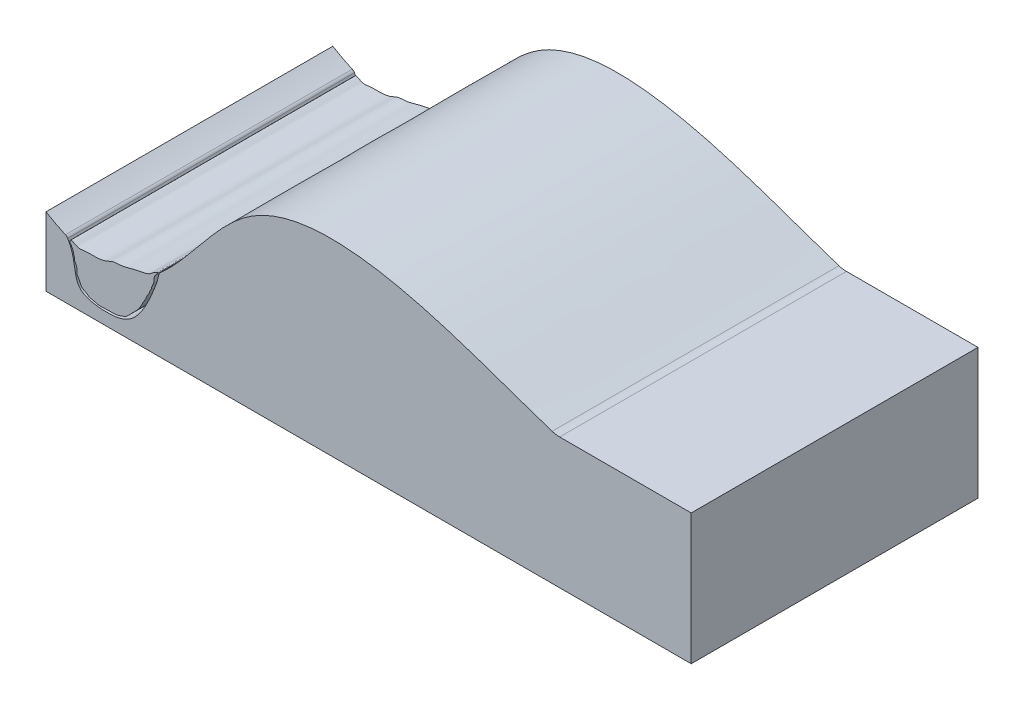
ISO-10303-21;
HEADER;
FILE_DESCRIPTION(('STEP AP214'),'2;1');
FILE_NAME('part.step','',(''),(''),'','','');
FILE_SCHEMA(('AUTOMOTIVE_DESIGN { 1 0 10303 214 1 1 1 1 }'));
ENDSEC;
DATA;
#1=APPLICATION_CONTEXT('core data for automotive mechanical design processes');
#2=APPLICATION_PROTOCOL_DEFINITION('international standard','automotive_design',2000,#1);
#3=PRODUCT_CONTEXT('',#1,'mechanical');
#4=PRODUCT('Part','Part','',(#3));
#5=PRODUCT_RELATED_PRODUCT_CATEGORY('part','',(#4));
#6=PRODUCT_DEFINITION_FORMATION('','',#4);
#7=PRODUCT_DEFINITION_CONTEXT('part definition',#1,'design');
#8=PRODUCT_DEFINITION('design','',#6,#7);
#9=PRODUCT_DEFINITION_SHAPE('','',#8);
#10=(LENGTH_UNIT() NAMED_UNIT(*) SI_UNIT(.MILLI.,.METRE.));
#11=(NAMED_UNIT(*) PLANE_ANGLE_UNIT() SI_UNIT($,.RADIAN.));
#12=(NAMED_UNIT(*) SI_UNIT($,.STERADIAN.) SOLID_ANGLE_UNIT());
#13=UNCERTAINTY_MEASURE_WITH_UNIT(LENGTH_MEASURE(1.E-05),#10,'distance_accuracy_value','');
#14=(GEOMETRIC_REPRESENTATION_CONTEXT(3) GLOBAL_UNCERTAINTY_ASSIGNED_CONTEXT((#13)) GLOBAL_UNIT_ASSIGNED_CONTEXT((#10,
#11,#12)) REPRESENTATION_CONTEXT('',''));
#15=CARTESIAN_POINT('',(0.,0.,0.));
#16=DIRECTION('',(0.,0.,1.));
#17=DIRECTION('',(1.,0.,0.));
#18=AXIS2_PLACEMENT_3D('',#15,#16,#17);
#19=CARTESIAN_POINT('',(18453.120407378,42903.9943873051,-217957.146));
#20=CARTESIAN_POINT('',(18203.1148026914,42439.5432046813,-217957.146));
#21=CARTESIAN_POINT('',(18070.7865840189,41127.0455180154,-217957.146));
#22=CARTESIAN_POINT('',(19282.2145590177,40516.7158260196,-217957.146));
#23=CARTESIAN_POINT('',(19537.7374002564,39469.7636240966,-217957.146));
#24=CARTESIAN_POINT('',(20297.8759646065,38469.1216104898,-217957.146));
#25=CARTESIAN_POINT('',(20759.1419337716,37218.3682673327,-217957.146));
#26=CARTESIAN_POINT('',(21089.9603759941,36107.5250728247,-217957.146));
#27=CARTESIAN_POINT('',(21115.2633461285,35254.8342591941,-217957.146));
#28=CARTESIAN_POINT('',(21460.4638072928,34502.1710613167,-217957.146));
#29=CARTESIAN_POINT('',(21621.4709321931,33635.4798391311,-217957.146));
#30=CARTESIAN_POINT('',(22007.1643704412,32713.1135226253,-217957.146));
#31=CARTESIAN_POINT('',(21931.7260022285,31903.5382757547,-217957.146));
#32=CARTESIAN_POINT('',(21873.2078152518,31131.155966318,-217957.146));
#33=CARTESIAN_POINT('',(22343.2117233786,30428.7305689686,-217957.146));
#34=CARTESIAN_POINT('',(22873.704039919,29744.9815546628,-217957.146));
#35=CARTESIAN_POINT('',(22878.4593514821,28895.8600068504,-217957.146));
#36=CARTESIAN_POINT('',(23660.2442996175,27985.5433933988,-217957.146));
#37=CARTESIAN_POINT('',(23527.0895336415,26476.9018335342,-217957.146));
#38=CARTESIAN_POINT('',(23757.7905491988,24769.5224805877,-217957.146));
#39=CARTESIAN_POINT('',(23527.9884886866,23006.2054731982,-217957.146));
#40=CARTESIAN_POINT('',(25051.1583024233,21270.8784655501,-217957.146));
#41=CARTESIAN_POINT('',(26082.9072055749,19021.3828018486,-217957.146));
#42=CARTESIAN_POINT('',(27304.7137493868,15781.2384394435,-217957.146));
#43=CARTESIAN_POINT('',(30638.8272396351,14774.5947712978,-217957.146));
#44=CARTESIAN_POINT('',(33326.8486721414,12299.9786082345,-217957.146));
#45=CARTESIAN_POINT('',(36520.9117968575,12108.4123723492,-217957.146));
#46=CARTESIAN_POINT('',(39786.728131325,10843.9441147948,-217957.146));
#47=CARTESIAN_POINT('',(43379.518356676,11131.8259705698,-217957.146));
#48=CARTESIAN_POINT('',(47077.0138418892,11118.5373920311,-217957.146));
#49=CARTESIAN_POINT('',(50672.1846078707,11282.3295422937,-217957.146));
#50=CARTESIAN_POINT('',(54454.2648118423,11179.5325122391,-217957.146));
#51=CARTESIAN_POINT('',(57894.7691915825,12644.0029044955,-217957.146));
#52=CARTESIAN_POINT('',(61435.8294770515,13764.8994775494,-217957.146));
#53=CARTESIAN_POINT('',(63729.2647813669,16312.8744576645,-217957.146));
#54=CARTESIAN_POINT('',(66260.075599825,18679.8959949824,-217957.146));
#55=CARTESIAN_POINT('',(68431.7918497825,21204.4500019919,-217957.146));
#56=CARTESIAN_POINT('',(70755.1438688806,23302.3136415229,-217957.146));
#57=CARTESIAN_POINT('',(72158.7838580752,25747.5678485187,-217957.146));
#58=CARTESIAN_POINT('',(73690.9638617059,28196.472307104,-217957.146));
#59=CARTESIAN_POINT('',(74618.2784756751,30683.6430975391,-217957.146));
#60=CARTESIAN_POINT('',(76552.9934465226,32965.4591929348,-217957.146));
#61=CARTESIAN_POINT('',(76995.7119309682,35793.4659308945,-217957.146));
#62=CARTESIAN_POINT('',(79031.0750282337,37598.4746489586,-217957.146));
#63=CARTESIAN_POINT('',(79194.0937732828,39860.4056586141,-217957.146));
#64=CARTESIAN_POINT('',(80640.1146720713,41164.4277622982,-217957.146));
#65=CARTESIAN_POINT('',(80694.097635989,43387.6648043391,-217957.146));
#66=CARTESIAN_POINT('',(81786.1815944237,45027.4304780346,-217957.146));
#67=CARTESIAN_POINT('',(82536.5594614461,46912.3623427988,-217957.146));
#68=CARTESIAN_POINT('',(82652.2091346204,48852.6132211194,-217957.146));
#69=CARTESIAN_POINT('',(82687.6500420254,51130.4422403183,-217957.146));
#70=CARTESIAN_POINT('',(84079.8289475113,52690.5612934202,-217957.146));
#71=CARTESIAN_POINT('',(86286.3839748042,55943.792197896,-217957.146));
#72=CARTESIAN_POINT('',(81449.8345280388,53125.8907607155,-217957.146));
#73=CARTESIAN_POINT('',(78836.8328627755,50436.5980074668,-217957.146));
#74=CARTESIAN_POINT('',(72346.051931403,49244.9439620969,-217957.146));
#75=CARTESIAN_POINT('',(65378.1528514533,47875.2527393667,-217957.146));
#76=CARTESIAN_POINT('',(58555.2407215721,45493.8790615314,-217957.146));
#77=CARTESIAN_POINT('',(51483.2006106164,45890.3030960841,-217957.146));
#78=CARTESIAN_POINT('',(45520.1415024761,42410.2060821302,-217957.146));
#79=CARTESIAN_POINT('',(37537.5175407025,41407.4955008268,-217957.146));
#80=CARTESIAN_POINT('',(30183.9146566245,41954.9182345952,-217957.146));
#81=CARTESIAN_POINT('',(23962.7542459087,40353.9665108862,-217957.146));
#82=CARTESIAN_POINT('',(19279.0411645446,44438.3594784422,-217957.146));
#83=CARTESIAN_POINT('',(18453.120407378,42903.9943873051,-217957.146));
#84=B_SPLINE_CURVE_WITH_KNOTS('',3,(#19,#20,#21,#22,#23,#24,#25,#26,#27,#28,#29,#30,#31,#32,#33,
#34,#35,#36,#37,#38,#39,#40,#41,#42,#43,#44,#45,#46,#47,#48,#49,#50,#51,#52,#53,#54,#55,#56,#57,
#58,#59,#60,#61,#62,#63,#64,#65,#66,#67,#68,#69,#70,#71,#72,#73,#74,#75,#76,#77,#78,#79,#80,#81,
#82,#83),.UNSPECIFIED.,.T.,.F.,(4,1,1,1,1,1,1,1,1,1,1,1,1,1,1,1,1,1,1,1,1,1,1,1,1,1,1,1,1,1,1,1,
1,1,1,1,1,1,1,1,1,1,1,1,1,1,1,1,1,1,1,1,1,1,1,1,1,1,1,1,1,1,4),(0.,0.0097554322366048,
0.0156681170548125,0.020243348716402,0.0266970056659213,0.0362738336504634,0.0420199304411887,
0.0457652070667872,0.0501722621278018,0.0554688831265622,0.0603188689683269,0.0663579460671775,
0.0686806680282739,0.0728356793865483,0.0796945951412897,0.0825203083639413,0.0862655849895397,
0.0984858400073749,0.105469473536518,0.115235960090819,0.126070904107022,0.14123811844707,
0.157032627782526,0.179979428023854,0.19402373519797,0.216107923493983,0.23008291367537,
0.251457004516592,0.274224419490769,0.291418838483833,0.310951811592434,0.335782133048714,
0.352434607869591,0.371184024687874,0.3908929740819,0.409956282113419,0.426055275631748,
0.442160970084193,0.456105042107834,0.473763840380501,0.485488410761632,0.504642066730716,
0.518686373904832,0.527364779335987,0.540272093235025,0.547834328054887,0.562597779794429,
0.572004086820057,0.580879194971791,0.594938859512085,0.606663429893216,0.618936548553727,
0.637852120823782,0.658106469417179,0.694415301906252,0.735783234345221,0.779274613725288,
0.811449134059962,0.849671851168482,0.889231836285604,0.943151013809343,0.967771866596964,1.),.UNSPECIFIED.);
#85=DIRECTION('',(0.,0.,1.));
#86=VECTOR('',#85,1.);
#87=SURFACE_OF_LINEAR_EXTRUSION('',#84,#86);
#88=CARTESIAN_POINT('',(18453.120407378,42903.9943873051,-217957.146));
#89=VERTEX_POINT('',#88);
#90=EDGE_CURVE('E11',#89,#89,#84,.T.);
#91=ORIENTED_EDGE('',*,*,#90,.T.);
#92=EDGE_LOOP('',(#91));
#93=FACE_BOUND('',#92,.T.);
#94=CARTESIAN_POINT('',(18453.120407378,42903.9943873051,0.));
#95=CARTESIAN_POINT('',(18203.1148026914,42439.5432046813,0.));
#96=CARTESIAN_POINT('',(18070.7865840189,41127.0455180154,0.));
#97=CARTESIAN_POINT('',(19282.2145590177,40516.7158260196,0.));
#98=CARTESIAN_POINT('',(19537.7374002564,39469.7636240966,0.));
#99=CARTESIAN_POINT('',(20297.8759646065,38469.1216104898,0.));
#100=CARTESIAN_POINT('',(20759.1419337716,37218.3682673327,0.));
#101=CARTESIAN_POINT('',(21089.9603759941,36107.5250728247,0.));
#102=CARTESIAN_POINT('',(21115.2633461285,35254.8342591941,0.));
#103=CARTESIAN_POINT('',(21460.4638072928,34502.1710613167,0.));
#104=CARTESIAN_POINT('',(21621.4709321931,33635.4798391311,0.));
#105=CARTESIAN_POINT('',(22007.1643704412,32713.1135226253,0.));
#106=CARTESIAN_POINT('',(21931.7260022285,31903.5382757547,0.));
#107=CARTESIAN_POINT('',(21873.2078152518,31131.155966318,0.));
#108=CARTESIAN_POINT('',(22343.2117233786,30428.7305689686,0.));
#109=CARTESIAN_POINT('',(22873.704039919,29744.9815546628,0.));
#110=CARTESIAN_POINT('',(22878.4593514821,28895.8600068504,0.));
#111=CARTESIAN_POINT('',(23660.2442996175,27985.5433933988,0.));
#112=CARTESIAN_POINT('',(23527.0895336415,26476.9018335342,0.));
#113=CARTESIAN_POINT('',(23757.7905491988,24769.5224805877,0.));
#114=CARTESIAN_POINT('',(23527.9884886866,23006.2054731982,0.));
#115=CARTESIAN_POINT('',(25051.1583024233,21270.8784655501,0.));
#116=CARTESIAN_POINT('',(26082.9072055749,19021.3828018486,0.));
#117=CARTESIAN_POINT('',(27304.7137493868,15781.2384394435,0.));
#118=CARTESIAN_POINT('',(30638.8272396351,14774.5947712978,0.));
#119=CARTESIAN_POINT('',(33326.8486721414,12299.9786082345,0.));
#120=CARTESIAN_POINT('',(36520.9117968575,12108.4123723492,0.));
#121=CARTESIAN_POINT('',(39786.728131325,10843.9441147948,0.));
#122=CARTESIAN_POINT('',(43379.518356676,11131.8259705698,0.));
#123=CARTESIAN_POINT('',(47077.0138418892,11118.5373920311,0.));
#124=CARTESIAN_POINT('',(50672.1846078707,11282.3295422937,0.));
#125=CARTESIAN_POINT('',(54454.2648118423,11179.5325122391,0.));
#126=CARTESIAN_POINT('',(57894.7691915825,12644.0029044955,0.));
#127=CARTESIAN_POINT('',(61435.8294770515,13764.8994775494,0.));
#128=CARTESIAN_POINT('',(63729.2647813669,16312.8744576645,0.));
#129=CARTESIAN_POINT('',(66260.075599825,18679.8959949824,0.));
#130=CARTESIAN_POINT('',(68431.7918497825,21204.4500019919,0.));
#131=CARTESIAN_POINT('',(70755.1438688806,23302.3136415229,0.));
#132=CARTESIAN_POINT('',(72158.7838580752,25747.5678485187,0.));
#133=CARTESIAN_POINT('',(73690.9638617059,28196.472307104,0.));
#134=CARTESIAN_POINT('',(74618.2784756751,30683.6430975391,0.));
#135=CARTESIAN_POINT('',(76552.9934465226,32965.4591929348,0.));
#136=CARTESIAN_POINT('',(76995.7119309682,35793.4659308945,0.));
#137=CARTESIAN_POINT('',(79031.0750282337,37598.4746489586,0.));
#138=CARTESIAN_POINT('',(79194.0937732828,39860.4056586141,0.));
#139=CARTESIAN_POINT('',(80640.1146720713,41164.4277622982,0.));
#140=CARTESIAN_POINT('',(80694.097635989,43387.6648043391,0.));
#141=CARTESIAN_POINT('',(81786.1815944237,45027.4304780346,0.));
#142=CARTESIAN_POINT('',(82536.5594614461,46912.3623427988,0.));
#143=CARTESIAN_POINT('',(82652.2091346204,48852.6132211194,0.));
#144=CARTESIAN_POINT('',(82687.6500420254,51130.4422403183,0.));
#145=CARTESIAN_POINT('',(84079.8289475113,52690.5612934202,0.));
#146=CARTESIAN_POINT('',(86286.3839748042,55943.792197896,0.));
#147=CARTESIAN_POINT('',(81449.8345280388,53125.8907607155,0.));
#148=CARTESIAN_POINT('',(78836.8328627755,50436.5980074668,0.));
#149=CARTESIAN_POINT('',(72346.051931403,49244.9439620969,0.));
#150=CARTESIAN_POINT('',(65378.1528514533,47875.2527393667,0.));
#151=CARTESIAN_POINT('',(58555.2407215721,45493.8790615314,0.));
#152=CARTESIAN_POINT('',(51483.2006106164,45890.3030960841,0.));
#153=CARTESIAN_POINT('',(45520.1415024761,42410.2060821302,0.));
#154=CARTESIAN_POINT('',(37537.5175407025,41407.4955008268,0.));
#155=CARTESIAN_POINT('',(30183.9146566245,41954.9182345952,0.));
#156=CARTESIAN_POINT('',(23962.7542459087,40353.9665108862,0.));
#157=CARTESIAN_POINT('',(19279.0411645446,44438.3594784422,0.));
#158=CARTESIAN_POINT('',(18453.120407378,42903.9943873051,0.));
#159=B_SPLINE_CURVE_WITH_KNOTS('',3,(#94,#95,#96,#97,#98,#99,#100,#101,#102,#103,#104,#105,#106,
#107,#108,#109,#110,#111,#112,#113,#114,#115,#116,#117,#118,#119,#120,#121,#122,#123,#124,#125,
#126,#127,#128,#129,#130,#131,#132,#133,#134,#135,#136,#137,#138,#139,#140,#141,#142,#143,#144,
#145,#146,#147,#148,#149,#150,#151,#152,#153,#154,#155,#156,#157,#158),.UNSPECIFIED.,.T.,.F.,(4,
1,1,1,1,1,1,1,1,1,1,1,1,1,1,1,1,1,1,1,1,1,1,1,1,1,1,1,1,1,1,1,1,1,1,1,1,1,1,1,1,1,1,1,1,1,1,1,1,
1,1,1,1,1,1,1,1,1,1,1,1,1,4),(0.,0.0097554322366048,0.0156681170548125,0.020243348716402,
0.0266970056659213,0.0362738336504634,0.0420199304411887,0.0457652070667872,0.0501722621278018,
0.0554688831265622,0.0603188689683269,0.0663579460671775,0.0686806680282739,0.0728356793865483,
0.0796945951412897,0.0825203083639413,0.0862655849895397,0.0984858400073749,0.105469473536518,
0.115235960090819,0.126070904107022,0.14123811844707,0.157032627782526,0.179979428023854,
0.19402373519797,0.216107923493983,0.23008291367537,0.251457004516592,0.274224419490769,
0.291418838483833,0.310951811592434,0.335782133048714,0.352434607869591,0.371184024687874,
0.3908929740819,0.409956282113419,0.426055275631748,0.442160970084193,0.456105042107834,
0.473763840380501,0.485488410761632,0.504642066730716,0.518686373904832,0.527364779335987,
0.540272093235025,0.547834328054887,0.562597779794429,0.572004086820057,0.580879194971791,
0.594938859512085,0.606663429893216,0.618936548553727,0.637852120823782,0.658106469417179,
0.694415301906252,0.735783234345221,0.779274613725288,0.811449134059962,0.849671851168482,
0.889231836285604,0.943151013809343,0.967771866596964,1.),.UNSPECIFIED.);
#160=CARTESIAN_POINT('',(18453.120407378,42903.9943873051,0.));
#161=VERTEX_POINT('',#160);
#162=EDGE_CURVE('E49',#161,#161,#159,.T.);
#163=ORIENTED_EDGE('',*,*,#162,.F.);
#164=EDGE_LOOP('',(#163));
#165=FACE_BOUND('',#164,.T.);
#166=ADVANCED_FACE('F45',(#93,#165),#87,.T.);
#167=CARTESIAN_POINT('',(77089.9721542229,35145.7179828665,-217957.146));
#168=DIRECTION('',(0.,0.,1.));
#169=DIRECTION('',(1.,0.,0.));
#170=AXIS2_PLACEMENT_3D('',#167,#168,#169);
#171=PLANE('',#170);
#172=ORIENTED_EDGE('',*,*,#90,.F.);
#173=EDGE_LOOP('',(#172));
#174=FACE_BOUND('',#173,.T.);
#175=ADVANCED_FACE('F68',(#174),#171,.F.);
#176=CARTESIAN_POINT('',(77089.9721542229,35145.7179828665,0.));
#177=DIRECTION('',(0.,0.,1.));
#178=DIRECTION('',(1.,0.,0.));
#179=AXIS2_PLACEMENT_3D('',#176,#177,#178);
#180=PLANE('',#179);
#181=ORIENTED_EDGE('',*,*,#162,.T.);
#182=EDGE_LOOP('',(#181));
#183=FACE_BOUND('',#182,.T.);
#184=ADVANCED_FACE('F65',(#183),#180,.T.);
#185=CLOSED_SHELL('',(#166,#175,#184));
#186=MANIFOLD_SOLID_BREP('B2',#185);
#187=CARTESIAN_POINT('',(0.,52667.8814282755,-271472.66));
#188=CARTESIAN_POINT('',(83559.6572341252,2393.55245964513,-271472.66));
#189=CARTESIAN_POINT('',(133616.286871643,210787.472707253,-271472.66));
#190=CARTESIAN_POINT('',(330012.548128856,118598.212832559,-271472.66));
#191=CARTESIAN_POINT('',(390144.,99964.3641700831,-271472.66));
#192=B_SPLINE_CURVE_WITH_KNOTS('',3,(#187,#188,#189,#190,#191),.UNSPECIFIED.,.F.,.F.,(4,1,4),
(0.,0.441082236898195,1.),.UNSPECIFIED.);
#193=DIRECTION('',(0.,0.,1.));
#194=VECTOR('',#193,1.);
#195=SURFACE_OF_LINEAR_EXTRUSION('',#192,#194);
#196=CARTESIAN_POINT('',(0.,52667.8814282755,0.));
#197=CARTESIAN_POINT('',(83559.6572341252,2393.55245964513,0.));
#198=CARTESIAN_POINT('',(133616.286871643,210787.472707253,0.));
#199=CARTESIAN_POINT('',(330012.548128856,118598.212832559,0.));
#200=CARTESIAN_POINT('',(390144.,99964.3641700831,0.));
#201=B_SPLINE_CURVE_WITH_KNOTS('',3,(#196,#197,#198,#199,#200),.UNSPECIFIED.,.F.,.F.,(4,1,4),
(0.,0.441082236898195,1.),.UNSPECIFIED.);
#202=CARTESIAN_POINT('',(0.,52667.8814282755,0.));
#203=VERTEX_POINT('',#202);
#204=CARTESIAN_POINT('',(14878.7542820508,44898.1992062694,0.));
#205=VERTEX_POINT('',#204);
#206=EDGE_CURVE('E240',#203,#205,#201,.T.);
#207=ORIENTED_EDGE('',*,*,#206,.T.);
#208=DIRECTION('',(0.,0.,1.));
#209=VECTOR('',#208,1.);
#210=CARTESIAN_POINT('',(14878.7542820508,44898.1992062694,0.));
#211=LINE('',#210,#209);
#212=CARTESIAN_POINT('',(14878.7542820508,44898.1992062694,-219456.));
#213=VERTEX_POINT('',#212);
#214=EDGE_CURVE('E283',#205,#213,#211,.F.);
#215=ORIENTED_EDGE('',*,*,#214,.T.);
#216=CARTESIAN_POINT('',(0.,52667.8814282755,-219456.));
#217=CARTESIAN_POINT('',(83559.6572341252,2393.55245964513,-219456.));
#218=CARTESIAN_POINT('',(133616.286871643,210787.472707253,-219456.));
#219=CARTESIAN_POINT('',(330012.548128856,118598.212832559,-219456.));
#220=CARTESIAN_POINT('',(390144.,99964.3641700831,-219456.));
#221=B_SPLINE_CURVE_WITH_KNOTS('',3,(#216,#217,#218,#219,#220),.UNSPECIFIED.,.F.,.F.,(4,1,4),
(0.,0.441082236898195,1.),.UNSPECIFIED.);
#222=CARTESIAN_POINT('',(0.,52667.8814282755,-219456.));
#223=VERTEX_POINT('',#222);
#224=EDGE_CURVE('E260',#223,#213,#221,.T.);
#225=ORIENTED_EDGE('',*,*,#224,.F.);
#226=DIRECTION('',(0.,0.,1.));
#227=VECTOR('',#226,1.);
#228=CARTESIAN_POINT('',(0.,52667.8814282755,-271472.66));
#229=LINE('',#228,#227);
#230=EDGE_CURVE('E248',#223,#203,#229,.T.);
#231=ORIENTED_EDGE('',*,*,#230,.T.);
#232=EDGE_LOOP('',(#207,#215,#225,#231));
#233=FACE_BOUND('',#232,.T.);
#234=ADVANCED_FACE('F97',(#233),#195,.F.);
#235=CARTESIAN_POINT('',(0.,163624.768,0.));
#236=DIRECTION('',(1.,0.,0.));
#237=DIRECTION('',(0.,0.,-1.));
#238=AXIS2_PLACEMENT_3D('',#235,#236,#237);
#239=PLANE('',#238);
#240=DIRECTION('',(0.,-1.,0.));
#241=VECTOR('',#240,1.);
#242=CARTESIAN_POINT('',(0.,163624.768,0.));
#243=LINE('',#242,#241);
#244=CARTESIAN_POINT('',(0.,0.,0.));
#245=VERTEX_POINT('',#244);
#246=EDGE_CURVE('E180',#203,#245,#243,.T.);
#247=ORIENTED_EDGE('',*,*,#246,.F.);
#248=ORIENTED_EDGE('',*,*,#230,.F.);
#249=DIRECTION('',(0.,-1.,0.));
#250=VECTOR('',#249,1.);
#251=CARTESIAN_POINT('',(0.,163624.768,-219456.));
#252=LINE('',#251,#250);
#253=CARTESIAN_POINT('',(0.,0.,-219456.));
#254=VERTEX_POINT('',#253);
#255=EDGE_CURVE('E256',#223,#254,#252,.T.);
#256=ORIENTED_EDGE('',*,*,#255,.T.);
#257=DIRECTION('',(0.,0.,1.));
#258=VECTOR('',#257,1.);
#259=CARTESIAN_POINT('',(0.,0.,0.));
#260=LINE('',#259,#258);
#261=EDGE_CURVE('E185',#254,#245,#260,.T.);
#262=ORIENTED_EDGE('',*,*,#261,.T.);
#263=EDGE_LOOP('',(#247,#248,#256,#262));
#264=FACE_BOUND('',#263,.T.);
#265=ADVANCED_FACE('F313',(#264),#239,.F.);
#266=CARTESIAN_POINT('',(0.,163624.768,0.));
#267=DIRECTION('',(0.,0.,-1.));
#268=DIRECTION('',(-1.,0.,0.));
#269=AXIS2_PLACEMENT_3D('',#266,#267,#268);
#270=PLANE('',#269);
#271=CARTESIAN_POINT('',(87478.0178261134,56099.4209561433,0.));
#272=VERTEX_POINT('',#271);
#273=CARTESIAN_POINT('',(387287.021402485,100862.173359698,0.));
#274=VERTEX_POINT('',#273);
#275=EDGE_CURVE('E249',#272,#274,#201,.T.);
#276=ORIENTED_EDGE('',*,*,#275,.F.);
#277=CARTESIAN_POINT('',(89991.0645788728,53235.7352159746,0.));
#278=DIRECTION('',(0.,0.,-1.));
#279=DIRECTION('',(-1.,0.,0.));
#280=AXIS2_PLACEMENT_3D('',#277,#278,#279);
#281=CIRCLE('',#280,3810.);
#282=CARTESIAN_POINT('',(86239.2651486449,53899.1363279285,0.));
#283=VERTEX_POINT('',#282);
#284=EDGE_CURVE('E273',#272,#283,#281,.F.);
#285=ORIENTED_EDGE('',*,*,#284,.T.);
#286=CARTESIAN_POINT('',(15943.9389295738,44438.8014705258,0.));
#287=CARTESIAN_POINT('',(24000.9795622401,32165.0707473389,0.));
#288=CARTESIAN_POINT('',(17610.9447752439,11877.3009277303,0.));
#289=CARTESIAN_POINT('',(53463.0961453246,7585.18350306893,0.));
#290=CARTESIAN_POINT('',(74840.7565307184,15824.6682265008,0.));
#291=CARTESIAN_POINT('',(91313.903548003,64441.1489142759,0.));
#292=CARTESIAN_POINT('',(81506.8274084907,54111.2602985171,0.));
#293=CARTESIAN_POINT('',(76367.1066389326,50845.0289867643,0.));
#294=CARTESIAN_POINT('',(68202.5032877185,44982.0439797142,0.));
#295=CARTESIAN_POINT('',(56865.2681827291,41044.1305606629,0.));
#296=CARTESIAN_POINT('',(45351.2438702843,39680.8730855134,0.));
#297=CARTESIAN_POINT('',(35439.5273063804,39718.4685825858,0.));
#298=CARTESIAN_POINT('',(25773.1917894854,42444.451962246,0.));
#299=CARTESIAN_POINT('',(20914.1159025462,42940.0359625946,0.));
#300=CARTESIAN_POINT('',(14431.7495730972,46625.0992974388,0.));
#301=CARTESIAN_POINT('',(15512.4481788711,45096.1149340074,0.));
#302=CARTESIAN_POINT('',(15943.9389295738,44438.8014705258,0.));
#303=B_SPLINE_CURVE_WITH_KNOTS('',3,(#286,#287,#288,#289,#290,#291,#292,#293,#294,#295,#296,
#297,#298,#299,#300,#301,#302),.UNSPECIFIED.,.T.,.F.,(4,1,1,1,1,1,1,1,1,1,1,1,1,1,4),(0.,
0.165559326181111,0.2822292468609,0.438503589805214,0.608520178236622,0.616398336145814,
0.649041552384504,0.704919284220716,0.77132780570167,0.833559197293323,0.884172895910204,
0.92720111650038,0.979409139789541,0.991133553720695,1.),.UNSPECIFIED.);
#304=CARTESIAN_POINT('',(16612.6504092085,43377.0370458632,0.));
#305=VERTEX_POINT('',#304);
#306=EDGE_CURVE('E208',#305,#283,#303,.T.);
#307=ORIENTED_EDGE('',*,*,#306,.F.);
#308=CARTESIAN_POINT('',(13350.9365433793,41407.9452101538,0.));
#309=DIRECTION('',(0.,0.,-1.));
#310=DIRECTION('',(-1.,0.,0.));
#311=AXIS2_PLACEMENT_3D('',#308,#309,#310);
#312=CIRCLE('',#311,3810.);
#313=EDGE_CURVE('E271',#305,#205,#312,.F.);
#314=ORIENTED_EDGE('',*,*,#313,.T.);
#315=ORIENTED_EDGE('',*,*,#206,.F.);
#316=ORIENTED_EDGE('',*,*,#246,.T.);
#317=DIRECTION('',(1.,0.,0.));
#318=VECTOR('',#317,1.);
#319=CARTESIAN_POINT('',(0.,0.,0.));
#320=LINE('',#319,#318);
#321=CARTESIAN_POINT('',(493723.676,0.,0.));
#322=VERTEX_POINT('',#321);
#323=EDGE_CURVE('E173',#245,#322,#320,.T.);
#324=ORIENTED_EDGE('',*,*,#323,.T.);
#325=DIRECTION('',(0.,-1.,0.));
#326=VECTOR('',#325,1.);
#327=CARTESIAN_POINT('',(493723.676,0.,0.));
#328=LINE('',#327,#326);
#329=CARTESIAN_POINT('',(493723.676,99964.3641700831,0.));
#330=VERTEX_POINT('',#329);
#331=EDGE_CURVE('E177',#330,#322,#328,.T.);
#332=ORIENTED_EDGE('',*,*,#331,.F.);
#333=DIRECTION('',(-1.,0.,0.));
#334=VECTOR('',#333,1.);
#335=CARTESIAN_POINT('',(493723.676,99964.3641700831,0.));
#336=LINE('',#335,#334);
#337=CARTESIAN_POINT('',(393066.335270357,99964.3641700831,0.));
#338=VERTEX_POINT('',#337);
#339=EDGE_CURVE('E203',#330,#338,#336,.T.);
#340=ORIENTED_EDGE('',*,*,#339,.T.);
#341=CARTESIAN_POINT('',(393066.335270357,119014.364170083,0.));
#342=DIRECTION('',(0.,0.,-1.));
#343=DIRECTION('',(-1.,0.,0.));
#344=AXIS2_PLACEMENT_3D('',#341,#342,#343);
#345=CIRCLE('',#344,19050.);
#346=EDGE_CURVE('E105',#338,#274,#345,.T.);
#347=ORIENTED_EDGE('',*,*,#346,.T.);
#348=EDGE_LOOP('',(#276,#285,#307,#314,#315,#316,#324,#332,#340,#347));
#349=FACE_BOUND('',#348,.T.);
#350=ADVANCED_FACE('F175',(#349),#270,.F.);
#351=CARTESIAN_POINT('',(0.,163624.768,-219456.));
#352=DIRECTION('',(0.,0.,1.));
#353=DIRECTION('',(1.,0.,0.));
#354=AXIS2_PLACEMENT_3D('',#351,#352,#353);
#355=PLANE('',#354);
#356=CARTESIAN_POINT('',(15943.9389295738,44438.8014705258,-219456.));
#357=CARTESIAN_POINT('',(24000.9795622401,32165.0707473389,-219456.));
#358=CARTESIAN_POINT('',(17610.9447752439,11877.3009277303,-219456.));
#359=CARTESIAN_POINT('',(53463.0961453246,7585.18350306893,-219456.));
#360=CARTESIAN_POINT('',(74840.7565307184,15824.6682265008,-219456.));
#361=CARTESIAN_POINT('',(91313.903548003,64441.1489142759,-219456.));
#362=CARTESIAN_POINT('',(81506.8274084907,54111.2602985171,-219456.));
#363=CARTESIAN_POINT('',(76367.1066389326,50845.0289867643,-219456.));
#364=CARTESIAN_POINT('',(68202.5032877185,44982.0439797142,-219456.));
#365=CARTESIAN_POINT('',(56865.2681827291,41044.1305606629,-219456.));
#366=CARTESIAN_POINT('',(45351.2438702843,39680.8730855134,-219456.));
#367=CARTESIAN_POINT('',(35439.5273063804,39718.4685825858,-219456.));
#368=CARTESIAN_POINT('',(25773.1917894854,42444.451962246,-219456.));
#369=CARTESIAN_POINT('',(20914.1159025462,42940.0359625946,-219456.));
#370=CARTESIAN_POINT('',(14431.7495730972,46625.0992974388,-219456.));
#371=CARTESIAN_POINT('',(15512.4481788711,45096.1149340074,-219456.));
#372=CARTESIAN_POINT('',(15943.9389295738,44438.8014705258,-219456.));
#373=B_SPLINE_CURVE_WITH_KNOTS('',3,(#356,#357,#358,#359,#360,#361,#362,#363,#364,#365,#366,
#367,#368,#369,#370,#371,#372),.UNSPECIFIED.,.T.,.F.,(4,1,1,1,1,1,1,1,1,1,1,1,1,1,4),(0.,
0.165559326181111,0.2822292468609,0.438503589805214,0.608520178236622,0.616398336145814,
0.649041552384504,0.704919284220716,0.77132780570167,0.833559197293323,0.884172895910204,
0.92720111650038,0.979409139789541,0.991133553720695,1.),.UNSPECIFIED.);
#374=CARTESIAN_POINT('',(16612.6504092085,43377.0370458632,-219456.));
#375=VERTEX_POINT('',#374);
#376=CARTESIAN_POINT('',(86239.2651486449,53899.1363279285,-219456.));
#377=VERTEX_POINT('',#376);
#378=EDGE_CURVE('E237',#375,#377,#373,.T.);
#379=ORIENTED_EDGE('',*,*,#378,.T.);
#380=CARTESIAN_POINT('',(89991.0645788728,53235.7352159746,-219456.));
#381=DIRECTION('',(0.,0.,1.));
#382=DIRECTION('',(1.,0.,0.));
#383=AXIS2_PLACEMENT_3D('',#380,#381,#382);
#384=CIRCLE('',#383,3810.);
#385=CARTESIAN_POINT('',(87478.0178261134,56099.4209561433,-219456.));
#386=VERTEX_POINT('',#385);
#387=EDGE_CURVE('E281',#377,#386,#384,.F.);
#388=ORIENTED_EDGE('',*,*,#387,.T.);
#389=CARTESIAN_POINT('',(387287.021402485,100862.173359698,-219456.));
#390=VERTEX_POINT('',#389);
#391=EDGE_CURVE('E259',#386,#390,#221,.T.);
#392=ORIENTED_EDGE('',*,*,#391,.T.);
#393=CARTESIAN_POINT('',(393066.335270357,119014.364170083,-219456.));
#394=DIRECTION('',(0.,0.,1.));
#395=DIRECTION('',(1.,0.,0.));
#396=AXIS2_PLACEMENT_3D('',#393,#394,#395);
#397=CIRCLE('',#396,19050.);
#398=CARTESIAN_POINT('',(393066.335270357,99964.3641700831,-219456.));
#399=VERTEX_POINT('',#398);
#400=EDGE_CURVE('E43',#390,#399,#397,.T.);
#401=ORIENTED_EDGE('',*,*,#400,.T.);
#402=DIRECTION('',(-1.,0.,0.));
#403=VECTOR('',#402,1.);
#404=CARTESIAN_POINT('',(493723.676,99964.3641700831,-219456.));
#405=LINE('',#404,#403);
#406=CARTESIAN_POINT('',(493723.676,99964.3641700831,-219456.));
#407=VERTEX_POINT('',#406);
#408=EDGE_CURVE('E205',#407,#399,#405,.T.);
#409=ORIENTED_EDGE('',*,*,#408,.F.);
#410=DIRECTION('',(0.,1.,0.));
#411=VECTOR('',#410,1.);
#412=CARTESIAN_POINT('',(493723.676,0.,-219456.));
#413=LINE('',#412,#411);
#414=CARTESIAN_POINT('',(493723.676,0.,-219456.));
#415=VERTEX_POINT('',#414);
#416=EDGE_CURVE('E193',#415,#407,#413,.T.);
#417=ORIENTED_EDGE('',*,*,#416,.F.);
#418=DIRECTION('',(-1.,0.,0.));
#419=VECTOR('',#418,1.);
#420=CARTESIAN_POINT('',(0.,0.,-219456.));
#421=LINE('',#420,#419);
#422=EDGE_CURVE('E184',#415,#254,#421,.T.);
#423=ORIENTED_EDGE('',*,*,#422,.T.);
#424=ORIENTED_EDGE('',*,*,#255,.F.);
#425=ORIENTED_EDGE('',*,*,#224,.T.);
#426=CARTESIAN_POINT('',(13350.9365433793,41407.9452101538,-219456.));
#427=DIRECTION('',(0.,0.,1.));
#428=DIRECTION('',(1.,0.,0.));
#429=AXIS2_PLACEMENT_3D('',#426,#427,#428);
#430=CIRCLE('',#429,3810.);
#431=EDGE_CURVE('E279',#213,#375,#430,.F.);
#432=ORIENTED_EDGE('',*,*,#431,.T.);
#433=EDGE_LOOP('',(#379,#388,#392,#401,#409,#417,#423,#424,#425,#432));
#434=FACE_BOUND('',#433,.T.);
#435=ADVANCED_FACE('F296',(#434),#355,.F.);
#436=CARTESIAN_POINT('',(0.,0.,0.));
#437=DIRECTION('',(0.,-1.,0.));
#438=DIRECTION('',(0.,0.,-1.));
#439=AXIS2_PLACEMENT_3D('',#436,#437,#438);
#440=PLANE('',#439);
#441=ORIENTED_EDGE('',*,*,#261,.F.);
#442=ORIENTED_EDGE('',*,*,#422,.F.);
#443=DIRECTION('',(0.,0.,-1.));
#444=VECTOR('',#443,1.);
#445=CARTESIAN_POINT('',(493723.676,0.,0.));
#446=LINE('',#445,#444);
#447=EDGE_CURVE('E188',#322,#415,#446,.T.);
#448=ORIENTED_EDGE('',*,*,#447,.F.);
#449=ORIENTED_EDGE('',*,*,#323,.F.);
#450=EDGE_LOOP('',(#441,#442,#448,#449));
#451=FACE_BOUND('',#450,.T.);
#452=ADVANCED_FACE('F189',(#451),#440,.T.);
#453=ORIENTED_EDGE('',*,*,#275,.T.);
#454=DIRECTION('',(0.,0.,1.));
#455=VECTOR('',#454,1.);
#456=CARTESIAN_POINT('',(387287.021402485,100862.173359698,0.));
#457=LINE('',#456,#455);
#458=EDGE_CURVE('E118',#274,#390,#457,.F.);
#459=ORIENTED_EDGE('',*,*,#458,.T.);
#460=ORIENTED_EDGE('',*,*,#391,.F.);
#461=DIRECTION('',(0.,0.,1.));
#462=VECTOR('',#461,1.);
#463=CARTESIAN_POINT('',(87478.0178261134,56099.4209561433,-219456.));
#464=LINE('',#463,#462);
#465=EDGE_CURVE('E265',#386,#272,#464,.T.);
#466=ORIENTED_EDGE('',*,*,#465,.T.);
#467=EDGE_LOOP('',(#453,#459,#460,#466));
#468=FACE_BOUND('',#467,.T.);
#469=ADVANCED_FACE('F225',(#468),#195,.F.);
#470=CARTESIAN_POINT('',(15943.9389295738,44438.8014705258,-346295.98));
#471=CARTESIAN_POINT('',(24000.9795622401,32165.0707473389,-346295.98));
#472=CARTESIAN_POINT('',(17610.9447752439,11877.3009277303,-346295.98));
#473=CARTESIAN_POINT('',(53463.0961453246,7585.18350306893,-346295.98));
#474=CARTESIAN_POINT('',(74840.7565307184,15824.6682265008,-346295.98));
#475=CARTESIAN_POINT('',(91313.903548003,64441.1489142759,-346295.98));
#476=CARTESIAN_POINT('',(81506.8274084907,54111.2602985171,-346295.98));
#477=CARTESIAN_POINT('',(76367.1066389326,50845.0289867643,-346295.98));
#478=CARTESIAN_POINT('',(68202.5032877185,44982.0439797142,-346295.98));
#479=CARTESIAN_POINT('',(56865.2681827291,41044.1305606629,-346295.98));
#480=CARTESIAN_POINT('',(45351.2438702843,39680.8730855134,-346295.98));
#481=CARTESIAN_POINT('',(35439.5273063804,39718.4685825858,-346295.98));
#482=CARTESIAN_POINT('',(25773.1917894854,42444.451962246,-346295.98));
#483=CARTESIAN_POINT('',(20914.1159025462,42940.0359625946,-346295.98));
#484=CARTESIAN_POINT('',(14431.7495730972,46625.0992974388,-346295.98));
#485=CARTESIAN_POINT('',(15512.4481788711,45096.1149340074,-346295.98));
#486=CARTESIAN_POINT('',(15943.9389295738,44438.8014705258,-346295.98));
#487=B_SPLINE_CURVE_WITH_KNOTS('',3,(#470,#471,#472,#473,#474,#475,#476,#477,#478,#479,#480,
#481,#482,#483,#484,#485,#486),.UNSPECIFIED.,.T.,.F.,(4,1,1,1,1,1,1,1,1,1,1,1,1,1,4),(0.,
0.165559326181111,0.2822292468609,0.438503589805214,0.608520178236622,0.616398336145814,
0.649041552384504,0.704919284220716,0.77132780570167,0.833559197293323,0.884172895910204,
0.92720111650038,0.979409139789541,0.991133553720695,1.),.UNSPECIFIED.);
#488=DIRECTION('',(0.,0.,1.));
#489=VECTOR('',#488,1.);
#490=SURFACE_OF_LINEAR_EXTRUSION('',#487,#489);
#491=ORIENTED_EDGE('',*,*,#306,.T.);
#492=DIRECTION('',(0.,0.,1.));
#493=VECTOR('',#492,1.);
#494=CARTESIAN_POINT('',(86239.2651486449,53899.1363279285,0.));
#495=LINE('',#494,#493);
#496=EDGE_CURVE('E277',#283,#377,#495,.F.);
#497=ORIENTED_EDGE('',*,*,#496,.T.);
#498=ORIENTED_EDGE('',*,*,#378,.F.);
#499=DIRECTION('',(0.,0.,1.));
#500=VECTOR('',#499,1.);
#501=CARTESIAN_POINT('',(16612.6504092085,43377.0370458632,-219456.));
#502=LINE('',#501,#500);
#503=EDGE_CURVE('E275',#375,#305,#502,.T.);
#504=ORIENTED_EDGE('',*,*,#503,.T.);
#505=EDGE_LOOP('',(#491,#497,#498,#504));
#506=FACE_BOUND('',#505,.T.);
#507=ADVANCED_FACE('F220',(#506),#490,.F.);
#508=CARTESIAN_POINT('',(89991.0645788728,53235.7352159746,-109728.));
#509=DIRECTION('',(0.,0.,1.));
#510=DIRECTION('',(1.,0.,0.));
#511=AXIS2_PLACEMENT_3D('',#508,#509,#510);
#512=CYLINDRICAL_SURFACE('',#511,3810.);
#513=ORIENTED_EDGE('',*,*,#387,.F.);
#514=ORIENTED_EDGE('',*,*,#496,.F.);
#515=ORIENTED_EDGE('',*,*,#284,.F.);
#516=ORIENTED_EDGE('',*,*,#465,.F.);
#517=EDGE_LOOP('',(#513,#514,#515,#516));
#518=FACE_BOUND('',#517,.T.);
#519=ADVANCED_FACE('F224',(#518),#512,.T.);
#520=CARTESIAN_POINT('',(13350.9365433793,41407.9452101538,-109728.));
#521=DIRECTION('',(0.,0.,1.));
#522=DIRECTION('',(1.,0.,0.));
#523=AXIS2_PLACEMENT_3D('',#520,#521,#522);
#524=CYLINDRICAL_SURFACE('',#523,3810.);
#525=ORIENTED_EDGE('',*,*,#313,.F.);
#526=ORIENTED_EDGE('',*,*,#503,.F.);
#527=ORIENTED_EDGE('',*,*,#431,.F.);
#528=ORIENTED_EDGE('',*,*,#214,.F.);
#529=EDGE_LOOP('',(#525,#526,#527,#528));
#530=FACE_BOUND('',#529,.T.);
#531=ADVANCED_FACE('F307',(#530),#524,.T.);
#532=CARTESIAN_POINT('',(493723.676,99964.3641700831,0.));
#533=DIRECTION('',(0.,-1.,0.));
#534=DIRECTION('',(0.,0.,-1.));
#535=AXIS2_PLACEMENT_3D('',#532,#533,#534);
#536=PLANE('',#535);
#537=ORIENTED_EDGE('',*,*,#408,.T.);
#538=DIRECTION('',(0.,0.,-1.));
#539=VECTOR('',#538,1.);
#540=CARTESIAN_POINT('',(393066.335270357,99964.3641700831,0.));
#541=LINE('',#540,#539);
#542=EDGE_CURVE('E286',#399,#338,#541,.F.);
#543=ORIENTED_EDGE('',*,*,#542,.T.);
#544=ORIENTED_EDGE('',*,*,#339,.F.);
#545=DIRECTION('',(0.,0.,1.));
#546=VECTOR('',#545,1.);
#547=CARTESIAN_POINT('',(493723.676,99964.3641700831,0.));
#548=LINE('',#547,#546);
#549=EDGE_CURVE('E197',#407,#330,#548,.T.);
#550=ORIENTED_EDGE('',*,*,#549,.F.);
#551=EDGE_LOOP('',(#537,#543,#544,#550));
#552=FACE_BOUND('',#551,.T.);
#553=ADVANCED_FACE('F227',(#552),#536,.F.);
#554=CARTESIAN_POINT('',(493723.676,0.,0.));
#555=DIRECTION('',(-1.,0.,0.));
#556=DIRECTION('',(0.,0.,1.));
#557=AXIS2_PLACEMENT_3D('',#554,#555,#556);
#558=PLANE('',#557);
#559=ORIENTED_EDGE('',*,*,#331,.T.);
#560=ORIENTED_EDGE('',*,*,#447,.T.);
#561=ORIENTED_EDGE('',*,*,#416,.T.);
#562=ORIENTED_EDGE('',*,*,#549,.T.);
#563=EDGE_LOOP('',(#559,#560,#561,#562));
#564=FACE_BOUND('',#563,.T.);
#565=ADVANCED_FACE('F195',(#564),#558,.F.);
#566=CARTESIAN_POINT('',(393066.335270357,119014.364170083,-109728.));
#567=DIRECTION('',(0.,0.,1.));
#568=DIRECTION('',(1.,0.,0.));
#569=AXIS2_PLACEMENT_3D('',#566,#567,#568);
#570=CYLINDRICAL_SURFACE('',#569,19050.);
#571=ORIENTED_EDGE('',*,*,#400,.F.);
#572=ORIENTED_EDGE('',*,*,#458,.F.);
#573=ORIENTED_EDGE('',*,*,#346,.F.);
#574=ORIENTED_EDGE('',*,*,#542,.F.);
#575=EDGE_LOOP('',(#571,#572,#573,#574));
#576=FACE_BOUND('',#575,.T.);
#577=ADVANCED_FACE('F99',(#576),#570,.F.);
#578=CLOSED_SHELL('',(#234,#265,#350,#435,#452,#469,#507,#519,#531,#553,#565,#577));
#579=MANIFOLD_SOLID_BREP('B6',#578);
#580=ADVANCED_BREP_SHAPE_REPRESENTATION('',(#18,#186,#579),#14);
#581=SHAPE_DEFINITION_REPRESENTATION(#9,#580);
ENDSEC;
END-ISO-10303-21;
